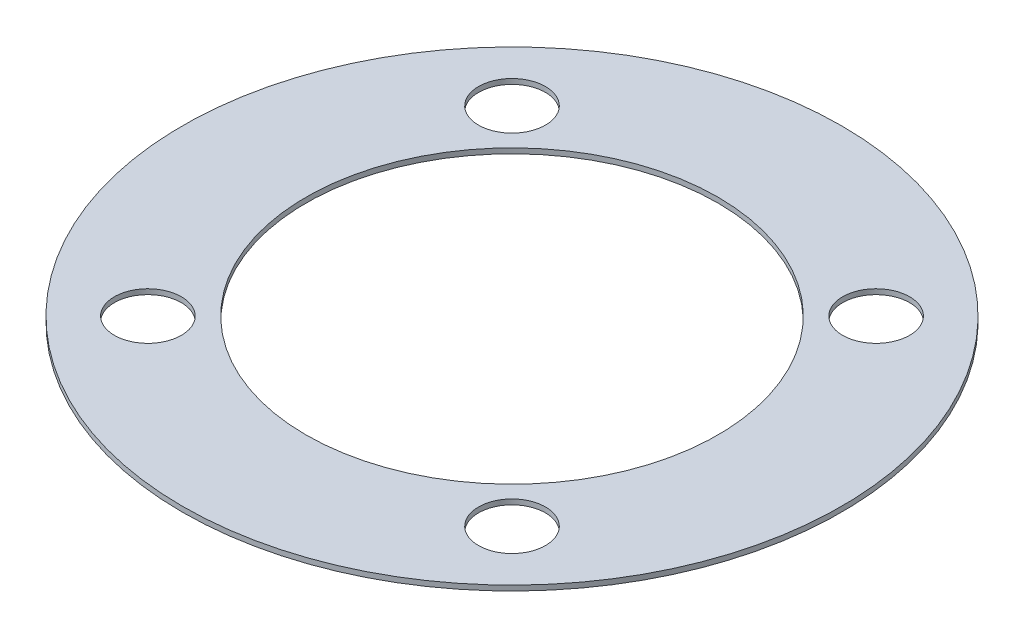
ISO-10303-21;
HEADER;
FILE_DESCRIPTION(('STEP AP214'),'2;1');
FILE_NAME('part.step','',(''),(''),'','','');
FILE_SCHEMA(('AUTOMOTIVE_DESIGN { 1 0 10303 214 1 1 1 1 }'));
ENDSEC;
DATA;
#1=APPLICATION_CONTEXT('core data for automotive mechanical design processes');
#2=APPLICATION_PROTOCOL_DEFINITION('international standard','automotive_design',2000,#1);
#3=PRODUCT_CONTEXT('',#1,'mechanical');
#4=PRODUCT('Part','Part','',(#3));
#5=PRODUCT_RELATED_PRODUCT_CATEGORY('part','',(#4));
#6=PRODUCT_DEFINITION_FORMATION('','',#4);
#7=PRODUCT_DEFINITION_CONTEXT('part definition',#1,'design');
#8=PRODUCT_DEFINITION('design','',#6,#7);
#9=PRODUCT_DEFINITION_SHAPE('','',#8);
#10=(LENGTH_UNIT() NAMED_UNIT(*) SI_UNIT(.MILLI.,.METRE.));
#11=(NAMED_UNIT(*) PLANE_ANGLE_UNIT() SI_UNIT($,.RADIAN.));
#12=(NAMED_UNIT(*) SI_UNIT($,.STERADIAN.) SOLID_ANGLE_UNIT());
#13=UNCERTAINTY_MEASURE_WITH_UNIT(LENGTH_MEASURE(1.E-05),#10,'distance_accuracy_value','');
#14=(GEOMETRIC_REPRESENTATION_CONTEXT(3) GLOBAL_UNCERTAINTY_ASSIGNED_CONTEXT((#13)) GLOBAL_UNIT_ASSIGNED_CONTEXT((#10,
#11,#12)) REPRESENTATION_CONTEXT('',''));
#15=CARTESIAN_POINT('',(0.,0.,0.));
#16=DIRECTION('',(0.,0.,1.));
#17=DIRECTION('',(1.,0.,0.));
#18=AXIS2_PLACEMENT_3D('',#15,#16,#17);
#19=CARTESIAN_POINT('',(0.,0.5,0.));
#20=DIRECTION('',(0.,1.,0.));
#21=DIRECTION('',(0.,0.,1.));
#22=AXIS2_PLACEMENT_3D('',#19,#20,#21);
#23=PLANE('',#22);
#24=CARTESIAN_POINT('',(17.6776695296636,0.5,17.6776695296638));
#25=DIRECTION('',(0.,1.,0.));
#26=DIRECTION('',(0.,0.,1.));
#27=AXIS2_PLACEMENT_3D('',#24,#25,#26);
#28=CIRCLE('',#27,3.25);
#29=CARTESIAN_POINT('',(17.6776695296636,0.5,20.9276695296638));
#30=VERTEX_POINT('',#29);
#31=EDGE_CURVE('E61',#30,#30,#28,.T.);
#32=ORIENTED_EDGE('',*,*,#31,.F.);
#33=EDGE_LOOP('',(#32));
#34=FACE_BOUND('',#33,.T.);
#35=CARTESIAN_POINT('',(-17.6776695296636,0.5,-17.6776695296638));
#36=DIRECTION('',(0.,1.,0.));
#37=DIRECTION('',(0.,0.,1.));
#38=AXIS2_PLACEMENT_3D('',#35,#36,#37);
#39=CIRCLE('',#38,3.25);
#40=CARTESIAN_POINT('',(-17.6776695296636,0.5,-14.4276695296638));
#41=VERTEX_POINT('',#40);
#42=EDGE_CURVE('E49',#41,#41,#39,.T.);
#43=ORIENTED_EDGE('',*,*,#42,.F.);
#44=EDGE_LOOP('',(#43));
#45=FACE_BOUND('',#44,.T.);
#46=CARTESIAN_POINT('',(0.,0.5,0.));
#47=DIRECTION('',(0.,1.,0.));
#48=DIRECTION('',(0.,0.,1.));
#49=AXIS2_PLACEMENT_3D('',#46,#47,#48);
#50=CIRCLE('',#49,32.);
#51=CARTESIAN_POINT('',(0.,0.5,32.));
#52=VERTEX_POINT('',#51);
#53=EDGE_CURVE('E10',#52,#52,#50,.T.);
#54=ORIENTED_EDGE('',*,*,#53,.T.);
#55=EDGE_LOOP('',(#54));
#56=FACE_BOUND('',#55,.T.);
#57=CARTESIAN_POINT('',(0.,0.5,0.));
#58=DIRECTION('',(0.,1.,0.));
#59=DIRECTION('',(0.,0.,1.));
#60=AXIS2_PLACEMENT_3D('',#57,#58,#59);
#61=CIRCLE('',#60,20.);
#62=CARTESIAN_POINT('',(0.,0.5,20.));
#63=VERTEX_POINT('',#62);
#64=EDGE_CURVE('E44',#63,#63,#61,.T.);
#65=ORIENTED_EDGE('',*,*,#64,.F.);
#66=EDGE_LOOP('',(#65));
#67=FACE_BOUND('',#66,.T.);
#68=CARTESIAN_POINT('',(17.6776695296638,0.5,-17.6776695296636));
#69=DIRECTION('',(0.,1.,0.));
#70=DIRECTION('',(0.,0.,1.));
#71=AXIS2_PLACEMENT_3D('',#68,#69,#70);
#72=CIRCLE('',#71,3.25);
#73=CARTESIAN_POINT('',(17.6776695296638,0.5,-14.4276695296636));
#74=VERTEX_POINT('',#73);
#75=EDGE_CURVE('E55',#74,#74,#72,.T.);
#76=ORIENTED_EDGE('',*,*,#75,.F.);
#77=EDGE_LOOP('',(#76));
#78=FACE_BOUND('',#77,.T.);
#79=CARTESIAN_POINT('',(-17.6776695296638,0.5,17.6776695296636));
#80=DIRECTION('',(0.,1.,0.));
#81=DIRECTION('',(0.,0.,1.));
#82=AXIS2_PLACEMENT_3D('',#79,#80,#81);
#83=CIRCLE('',#82,3.25);
#84=CARTESIAN_POINT('',(-17.6776695296638,0.5,20.9276695296636));
#85=VERTEX_POINT('',#84);
#86=EDGE_CURVE('E67',#85,#85,#83,.T.);
#87=ORIENTED_EDGE('',*,*,#86,.F.);
#88=EDGE_LOOP('',(#87));
#89=FACE_BOUND('',#88,.T.);
#90=ADVANCED_FACE('F33',(#34,#45,#56,#67,#78,#89),#23,.T.);
#91=CARTESIAN_POINT('',(0.,0.,0.));
#92=DIRECTION('',(0.,1.,0.));
#93=DIRECTION('',(0.,0.,1.));
#94=AXIS2_PLACEMENT_3D('',#91,#92,#93);
#95=PLANE('',#94);
#96=CARTESIAN_POINT('',(0.,0.,0.));
#97=DIRECTION('',(0.,1.,0.));
#98=DIRECTION('',(0.,0.,1.));
#99=AXIS2_PLACEMENT_3D('',#96,#97,#98);
#100=CIRCLE('',#99,32.);
#101=CARTESIAN_POINT('',(0.,0.,32.));
#102=VERTEX_POINT('',#101);
#103=EDGE_CURVE('E37',#102,#102,#100,.T.);
#104=ORIENTED_EDGE('',*,*,#103,.F.);
#105=EDGE_LOOP('',(#104));
#106=FACE_BOUND('',#105,.T.);
#107=CARTESIAN_POINT('',(0.,0.,0.));
#108=DIRECTION('',(0.,1.,0.));
#109=DIRECTION('',(0.,0.,1.));
#110=AXIS2_PLACEMENT_3D('',#107,#108,#109);
#111=CIRCLE('',#110,20.);
#112=CARTESIAN_POINT('',(0.,0.,20.));
#113=VERTEX_POINT('',#112);
#114=EDGE_CURVE('E46',#113,#113,#111,.T.);
#115=ORIENTED_EDGE('',*,*,#114,.T.);
#116=EDGE_LOOP('',(#115));
#117=FACE_BOUND('',#116,.T.);
#118=CARTESIAN_POINT('',(-17.6776695296636,0.,-17.6776695296638));
#119=DIRECTION('',(0.,1.,0.));
#120=DIRECTION('',(0.,0.,1.));
#121=AXIS2_PLACEMENT_3D('',#118,#119,#120);
#122=CIRCLE('',#121,3.25);
#123=CARTESIAN_POINT('',(-17.6776695296636,0.,-14.4276695296638));
#124=VERTEX_POINT('',#123);
#125=EDGE_CURVE('E52',#124,#124,#122,.T.);
#126=ORIENTED_EDGE('',*,*,#125,.T.);
#127=EDGE_LOOP('',(#126));
#128=FACE_BOUND('',#127,.T.);
#129=CARTESIAN_POINT('',(17.6776695296638,0.,-17.6776695296636));
#130=DIRECTION('',(0.,1.,0.));
#131=DIRECTION('',(0.,0.,1.));
#132=AXIS2_PLACEMENT_3D('',#129,#130,#131);
#133=CIRCLE('',#132,3.25);
#134=CARTESIAN_POINT('',(17.6776695296638,0.,-14.4276695296636));
#135=VERTEX_POINT('',#134);
#136=EDGE_CURVE('E58',#135,#135,#133,.T.);
#137=ORIENTED_EDGE('',*,*,#136,.T.);
#138=EDGE_LOOP('',(#137));
#139=FACE_BOUND('',#138,.T.);
#140=CARTESIAN_POINT('',(17.6776695296636,0.,17.6776695296638));
#141=DIRECTION('',(0.,1.,0.));
#142=DIRECTION('',(0.,0.,1.));
#143=AXIS2_PLACEMENT_3D('',#140,#141,#142);
#144=CIRCLE('',#143,3.25);
#145=CARTESIAN_POINT('',(17.6776695296636,0.,20.9276695296638));
#146=VERTEX_POINT('',#145);
#147=EDGE_CURVE('E64',#146,#146,#144,.T.);
#148=ORIENTED_EDGE('',*,*,#147,.T.);
#149=EDGE_LOOP('',(#148));
#150=FACE_BOUND('',#149,.T.);
#151=CARTESIAN_POINT('',(-17.6776695296638,0.,17.6776695296636));
#152=DIRECTION('',(0.,1.,0.));
#153=DIRECTION('',(0.,0.,1.));
#154=AXIS2_PLACEMENT_3D('',#151,#152,#153);
#155=CIRCLE('',#154,3.25);
#156=CARTESIAN_POINT('',(-17.6776695296638,0.,20.9276695296636));
#157=VERTEX_POINT('',#156);
#158=EDGE_CURVE('E70',#157,#157,#155,.T.);
#159=ORIENTED_EDGE('',*,*,#158,.T.);
#160=EDGE_LOOP('',(#159));
#161=FACE_BOUND('',#160,.T.);
#162=ADVANCED_FACE('F80',(#106,#117,#128,#139,#150,#161),#95,.F.);
#163=CARTESIAN_POINT('',(0.,0.5,0.));
#164=DIRECTION('',(0.,-1.,0.));
#165=DIRECTION('',(0.,0.,-1.));
#166=AXIS2_PLACEMENT_3D('',#163,#164,#165);
#167=CYLINDRICAL_SURFACE('',#166,32.);
#168=ORIENTED_EDGE('',*,*,#53,.F.);
#169=EDGE_LOOP('',(#168));
#170=FACE_BOUND('',#169,.T.);
#171=ORIENTED_EDGE('',*,*,#103,.T.);
#172=EDGE_LOOP('',(#171));
#173=FACE_BOUND('',#172,.T.);
#174=ADVANCED_FACE('F35',(#170,#173),#167,.T.);
#175=CARTESIAN_POINT('',(0.,0.5,0.));
#176=DIRECTION('',(0.,-1.,0.));
#177=DIRECTION('',(0.,0.,-1.));
#178=AXIS2_PLACEMENT_3D('',#175,#176,#177);
#179=CYLINDRICAL_SURFACE('',#178,20.);
#180=ORIENTED_EDGE('',*,*,#64,.T.);
#181=EDGE_LOOP('',(#180));
#182=FACE_BOUND('',#181,.T.);
#183=ORIENTED_EDGE('',*,*,#114,.F.);
#184=EDGE_LOOP('',(#183));
#185=FACE_BOUND('',#184,.T.);
#186=ADVANCED_FACE('F90',(#182,#185),#179,.F.);
#187=CARTESIAN_POINT('',(-17.6776695296636,0.5,-17.6776695296638));
#188=DIRECTION('',(0.,-1.,0.));
#189=DIRECTION('',(0.,0.,-1.));
#190=AXIS2_PLACEMENT_3D('',#187,#188,#189);
#191=CYLINDRICAL_SURFACE('',#190,3.25);
#192=ORIENTED_EDGE('',*,*,#42,.T.);
#193=EDGE_LOOP('',(#192));
#194=FACE_BOUND('',#193,.T.);
#195=ORIENTED_EDGE('',*,*,#125,.F.);
#196=EDGE_LOOP('',(#195));
#197=FACE_BOUND('',#196,.T.);
#198=ADVANCED_FACE('F93',(#194,#197),#191,.F.);
#199=CARTESIAN_POINT('',(17.6776695296638,0.5,-17.6776695296636));
#200=DIRECTION('',(0.,-1.,0.));
#201=DIRECTION('',(0.,0.,-1.));
#202=AXIS2_PLACEMENT_3D('',#199,#200,#201);
#203=CYLINDRICAL_SURFACE('',#202,3.25);
#204=ORIENTED_EDGE('',*,*,#75,.T.);
#205=EDGE_LOOP('',(#204));
#206=FACE_BOUND('',#205,.T.);
#207=ORIENTED_EDGE('',*,*,#136,.F.);
#208=EDGE_LOOP('',(#207));
#209=FACE_BOUND('',#208,.T.);
#210=ADVANCED_FACE('F97',(#206,#209),#203,.F.);
#211=CARTESIAN_POINT('',(17.6776695296636,0.5,17.6776695296638));
#212=DIRECTION('',(0.,-1.,0.));
#213=DIRECTION('',(0.,0.,-1.));
#214=AXIS2_PLACEMENT_3D('',#211,#212,#213);
#215=CYLINDRICAL_SURFACE('',#214,3.25);
#216=ORIENTED_EDGE('',*,*,#31,.T.);
#217=EDGE_LOOP('',(#216));
#218=FACE_BOUND('',#217,.T.);
#219=ORIENTED_EDGE('',*,*,#147,.F.);
#220=EDGE_LOOP('',(#219));
#221=FACE_BOUND('',#220,.T.);
#222=ADVANCED_FACE('F101',(#218,#221),#215,.F.);
#223=CARTESIAN_POINT('',(-17.6776695296638,0.5,17.6776695296636));
#224=DIRECTION('',(0.,-1.,0.));
#225=DIRECTION('',(0.,0.,-1.));
#226=AXIS2_PLACEMENT_3D('',#223,#224,#225);
#227=CYLINDRICAL_SURFACE('',#226,3.25);
#228=ORIENTED_EDGE('',*,*,#86,.T.);
#229=EDGE_LOOP('',(#228));
#230=FACE_BOUND('',#229,.T.);
#231=ORIENTED_EDGE('',*,*,#158,.F.);
#232=EDGE_LOOP('',(#231));
#233=FACE_BOUND('',#232,.T.);
#234=ADVANCED_FACE('F76',(#230,#233),#227,.F.);
#235=CLOSED_SHELL('',(#90,#162,#174,#186,#198,#210,#222,#234));
#236=MANIFOLD_SOLID_BREP('B2',#235);
#237=ADVANCED_BREP_SHAPE_REPRESENTATION('',(#18,#236),#14);
#238=SHAPE_DEFINITION_REPRESENTATION(#9,#237);
ENDSEC;
END-ISO-10303-21;
